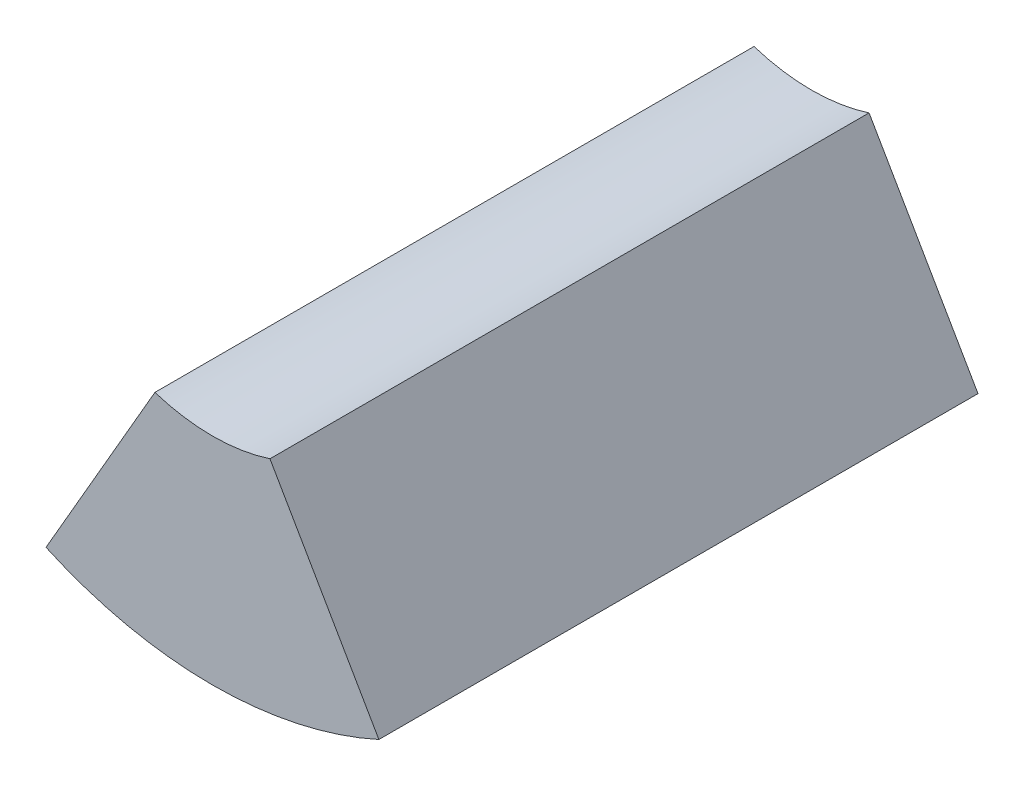
ISO-10303-21;
HEADER;
FILE_DESCRIPTION(('STEP AP214'),'2;1');
FILE_NAME('part.step','',(''),(''),'','','');
FILE_SCHEMA(('AUTOMOTIVE_DESIGN { 1 0 10303 214 1 1 1 1 }'));
ENDSEC;
DATA;
#1=APPLICATION_CONTEXT('core data for automotive mechanical design processes');
#2=APPLICATION_PROTOCOL_DEFINITION('international standard','automotive_design',2000,#1);
#3=PRODUCT_CONTEXT('',#1,'mechanical');
#4=PRODUCT('Part','Part','',(#3));
#5=PRODUCT_RELATED_PRODUCT_CATEGORY('part','',(#4));
#6=PRODUCT_DEFINITION_FORMATION('','',#4);
#7=PRODUCT_DEFINITION_CONTEXT('part definition',#1,'design');
#8=PRODUCT_DEFINITION('design','',#6,#7);
#9=PRODUCT_DEFINITION_SHAPE('','',#8);
#10=(LENGTH_UNIT() NAMED_UNIT(*) SI_UNIT(.MILLI.,.METRE.));
#11=(NAMED_UNIT(*) PLANE_ANGLE_UNIT() SI_UNIT($,.RADIAN.));
#12=(NAMED_UNIT(*) SI_UNIT($,.STERADIAN.) SOLID_ANGLE_UNIT());
#13=UNCERTAINTY_MEASURE_WITH_UNIT(LENGTH_MEASURE(1.E-05),#10,'distance_accuracy_value','');
#14=(GEOMETRIC_REPRESENTATION_CONTEXT(3) GLOBAL_UNCERTAINTY_ASSIGNED_CONTEXT((#13)) GLOBAL_UNIT_ASSIGNED_CONTEXT((#10,
#11,#12)) REPRESENTATION_CONTEXT('',''));
#15=CARTESIAN_POINT('',(0.,0.,0.));
#16=DIRECTION('',(0.,0.,1.));
#17=DIRECTION('',(1.,0.,0.));
#18=AXIS2_PLACEMENT_3D('',#15,#16,#17);
#19=CARTESIAN_POINT('',(0.,0.,-50.8));
#20=DIRECTION('',(0.,0.,-1.));
#21=DIRECTION('',(-1.,0.,0.));
#22=AXIS2_PLACEMENT_3D('',#19,#20,#21);
#23=PLANE('',#22);
#24=DIRECTION('',(0.499999999999998,-0.86602540378444,0.));
#25=VECTOR('',#24,1.);
#26=CARTESIAN_POINT('',(31.75,0.,-50.8));
#27=LINE('',#26,#25);
#28=CARTESIAN_POINT('',(20.7514773719377,19.05,-50.8));
#29=VERTEX_POINT('',#28);
#30=CARTESIAN_POINT('',(29.9879841462264,3.05190098247774,-50.8));
#31=VERTEX_POINT('',#30);
#32=EDGE_CURVE('E93',#29,#31,#27,.T.);
#33=ORIENTED_EDGE('',*,*,#32,.T.);
#34=CARTESIAN_POINT('',(15.875,34.1574681347001,-50.8));
#35=DIRECTION('',(0.,0.,1.));
#36=DIRECTION('',(1.,0.,0.));
#37=AXIS2_PLACEMENT_3D('',#34,#35,#36);
#38=CIRCLE('',#37,34.1574681347001);
#39=CARTESIAN_POINT('',(1.76201585377359,3.05190098247774,-50.8));
#40=VERTEX_POINT('',#39);
#41=EDGE_CURVE('E53',#40,#31,#38,.T.);
#42=ORIENTED_EDGE('',*,*,#41,.F.);
#43=DIRECTION('',(0.499999999999998,0.86602540378444,0.));
#44=VECTOR('',#43,1.);
#45=CARTESIAN_POINT('',(0.,0.,-50.8));
#46=LINE('',#45,#44);
#47=CARTESIAN_POINT('',(10.9985226280623,19.05,-50.8));
#48=VERTEX_POINT('',#47);
#49=EDGE_CURVE('E90',#40,#48,#46,.T.);
#50=ORIENTED_EDGE('',*,*,#49,.T.);
#51=CARTESIAN_POINT('',(15.875,34.1574681347001,-50.8));
#52=DIRECTION('',(0.,0.,1.));
#53=DIRECTION('',(1.,0.,0.));
#54=AXIS2_PLACEMENT_3D('',#51,#52,#53);
#55=CIRCLE('',#54,15.875);
#56=EDGE_CURVE('E113',#48,#29,#55,.T.);
#57=ORIENTED_EDGE('',*,*,#56,.T.);
#58=EDGE_LOOP('',(#33,#42,#50,#57));
#59=FACE_BOUND('',#58,.T.);
#60=ADVANCED_FACE('F38',(#59),#23,.T.);
#61=CARTESIAN_POINT('',(0.,0.,0.));
#62=DIRECTION('',(0.,0.,-1.));
#63=DIRECTION('',(-1.,0.,0.));
#64=AXIS2_PLACEMENT_3D('',#61,#62,#63);
#65=PLANE('',#64);
#66=CARTESIAN_POINT('',(15.875,34.1574681347001,0.));
#67=DIRECTION('',(0.,0.,1.));
#68=DIRECTION('',(1.,0.,0.));
#69=AXIS2_PLACEMENT_3D('',#66,#67,#68);
#70=CIRCLE('',#69,34.1574681347001);
#71=CARTESIAN_POINT('',(1.76201585377359,3.05190098247774,0.));
#72=VERTEX_POINT('',#71);
#73=CARTESIAN_POINT('',(29.9879841462264,3.05190098247774,0.));
#74=VERTEX_POINT('',#73);
#75=EDGE_CURVE('E81',#72,#74,#70,.T.);
#76=ORIENTED_EDGE('',*,*,#75,.T.);
#77=DIRECTION('',(0.499999999999998,-0.86602540378444,0.));
#78=VECTOR('',#77,1.);
#79=CARTESIAN_POINT('',(31.75,0.,0.));
#80=LINE('',#79,#78);
#81=CARTESIAN_POINT('',(20.7514773719377,19.05,0.));
#82=VERTEX_POINT('',#81);
#83=EDGE_CURVE('E109',#82,#74,#80,.T.);
#84=ORIENTED_EDGE('',*,*,#83,.F.);
#85=CARTESIAN_POINT('',(15.875,34.1574681347001,0.));
#86=DIRECTION('',(0.,0.,1.));
#87=DIRECTION('',(1.,0.,0.));
#88=AXIS2_PLACEMENT_3D('',#85,#86,#87);
#89=CIRCLE('',#88,15.875);
#90=CARTESIAN_POINT('',(10.9985226280623,19.05,0.));
#91=VERTEX_POINT('',#90);
#92=EDGE_CURVE('E61',#91,#82,#89,.T.);
#93=ORIENTED_EDGE('',*,*,#92,.F.);
#94=DIRECTION('',(0.499999999999998,0.86602540378444,0.));
#95=VECTOR('',#94,1.);
#96=CARTESIAN_POINT('',(0.,0.,0.));
#97=LINE('',#96,#95);
#98=EDGE_CURVE('E98',#72,#91,#97,.T.);
#99=ORIENTED_EDGE('',*,*,#98,.F.);
#100=EDGE_LOOP('',(#76,#84,#93,#99));
#101=FACE_BOUND('',#100,.T.);
#102=ADVANCED_FACE('F40',(#101),#65,.F.);
#103=CARTESIAN_POINT('',(0.,0.,-50.8));
#104=DIRECTION('',(0.86602540378444,-0.499999999999998,0.));
#105=DIRECTION('',(0.499999999999998,0.86602540378444,0.));
#106=AXIS2_PLACEMENT_3D('',#103,#104,#105);
#107=PLANE('',#106);
#108=DIRECTION('',(0.,0.,1.));
#109=VECTOR('',#108,1.);
#110=CARTESIAN_POINT('',(1.76201585377359,3.05190098247774,-50.8));
#111=LINE('',#110,#109);
#112=EDGE_CURVE('E79',#72,#40,#111,.F.);
#113=ORIENTED_EDGE('',*,*,#112,.F.);
#114=ORIENTED_EDGE('',*,*,#98,.T.);
#115=DIRECTION('',(0.,0.,1.));
#116=VECTOR('',#115,1.);
#117=CARTESIAN_POINT('',(10.9985226280623,19.05,-50.8));
#118=LINE('',#117,#116);
#119=EDGE_CURVE('E47',#48,#91,#118,.T.);
#120=ORIENTED_EDGE('',*,*,#119,.F.);
#121=ORIENTED_EDGE('',*,*,#49,.F.);
#122=EDGE_LOOP('',(#113,#114,#120,#121));
#123=FACE_BOUND('',#122,.T.);
#124=ADVANCED_FACE('F96',(#123),#107,.F.);
#125=CARTESIAN_POINT('',(31.75,0.,-50.8));
#126=DIRECTION('',(-0.86602540378444,-0.499999999999998,0.));
#127=DIRECTION('',(0.499999999999998,-0.86602540378444,0.));
#128=AXIS2_PLACEMENT_3D('',#125,#126,#127);
#129=PLANE('',#128);
#130=DIRECTION('',(0.,0.,1.));
#131=VECTOR('',#130,1.);
#132=CARTESIAN_POINT('',(29.9879841462264,3.05190098247774,-50.8));
#133=LINE('',#132,#131);
#134=EDGE_CURVE('E12',#31,#74,#133,.T.);
#135=ORIENTED_EDGE('',*,*,#134,.F.);
#136=ORIENTED_EDGE('',*,*,#32,.F.);
#137=DIRECTION('',(0.,0.,1.));
#138=VECTOR('',#137,1.);
#139=CARTESIAN_POINT('',(20.7514773719377,19.05,-50.8));
#140=LINE('',#139,#138);
#141=EDGE_CURVE('E104',#29,#82,#140,.T.);
#142=ORIENTED_EDGE('',*,*,#141,.T.);
#143=ORIENTED_EDGE('',*,*,#83,.T.);
#144=EDGE_LOOP('',(#135,#136,#142,#143));
#145=FACE_BOUND('',#144,.T.);
#146=ADVANCED_FACE('F124',(#145),#129,.F.);
#147=CARTESIAN_POINT('',(15.875,34.1574681347001,-50.8));
#148=DIRECTION('',(0.,0.,1.));
#149=DIRECTION('',(1.,0.,0.));
#150=AXIS2_PLACEMENT_3D('',#147,#148,#149);
#151=CYLINDRICAL_SURFACE('',#150,15.875);
#152=ORIENTED_EDGE('',*,*,#92,.T.);
#153=ORIENTED_EDGE('',*,*,#141,.F.);
#154=ORIENTED_EDGE('',*,*,#56,.F.);
#155=ORIENTED_EDGE('',*,*,#119,.T.);
#156=EDGE_LOOP('',(#152,#153,#154,#155));
#157=FACE_BOUND('',#156,.T.);
#158=ADVANCED_FACE('F125',(#157),#151,.F.);
#159=CARTESIAN_POINT('',(15.875,34.1574681347001,-50.8));
#160=DIRECTION('',(0.,0.,1.));
#161=DIRECTION('',(1.,0.,0.));
#162=AXIS2_PLACEMENT_3D('',#159,#160,#161);
#163=CYLINDRICAL_SURFACE('',#162,34.1574681347001);
#164=ORIENTED_EDGE('',*,*,#41,.T.);
#165=ORIENTED_EDGE('',*,*,#134,.T.);
#166=ORIENTED_EDGE('',*,*,#75,.F.);
#167=ORIENTED_EDGE('',*,*,#112,.T.);
#168=EDGE_LOOP('',(#164,#165,#166,#167));
#169=FACE_BOUND('',#168,.T.);
#170=ADVANCED_FACE('F80',(#169),#163,.T.);
#171=CLOSED_SHELL('',(#60,#102,#124,#146,#158,#170));
#172=MANIFOLD_SOLID_BREP('B2',#171);
#173=ADVANCED_BREP_SHAPE_REPRESENTATION('',(#18,#172),#14);
#174=SHAPE_DEFINITION_REPRESENTATION(#9,#173);
ENDSEC;
END-ISO-10303-21;
